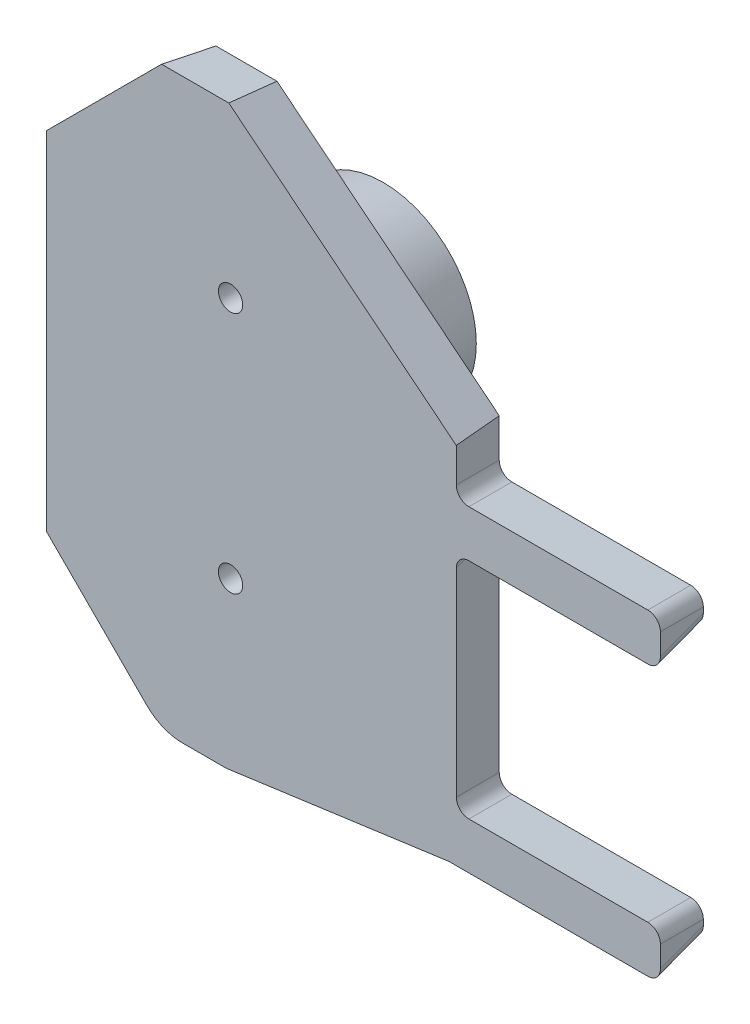
ISO-10303-21;
HEADER;
FILE_DESCRIPTION(('STEP AP214'),'2;1');
FILE_NAME('part.step','',(''),(''),'','','');
FILE_SCHEMA(('AUTOMOTIVE_DESIGN { 1 0 10303 214 1 1 1 1 }'));
ENDSEC;
DATA;
#1=APPLICATION_CONTEXT('core data for automotive mechanical design processes');
#2=APPLICATION_PROTOCOL_DEFINITION('international standard','automotive_design',2000,#1);
#3=PRODUCT_CONTEXT('',#1,'mechanical');
#4=PRODUCT('Part','Part','',(#3));
#5=PRODUCT_RELATED_PRODUCT_CATEGORY('part','',(#4));
#6=PRODUCT_DEFINITION_FORMATION('','',#4);
#7=PRODUCT_DEFINITION_CONTEXT('part definition',#1,'design');
#8=PRODUCT_DEFINITION('design','',#6,#7);
#9=PRODUCT_DEFINITION_SHAPE('','',#8);
#10=(LENGTH_UNIT() NAMED_UNIT(*) SI_UNIT(.MILLI.,.METRE.));
#11=(NAMED_UNIT(*) PLANE_ANGLE_UNIT() SI_UNIT($,.RADIAN.));
#12=(NAMED_UNIT(*) SI_UNIT($,.STERADIAN.) SOLID_ANGLE_UNIT());
#13=UNCERTAINTY_MEASURE_WITH_UNIT(LENGTH_MEASURE(1.E-05),#10,'distance_accuracy_value','');
#14=(GEOMETRIC_REPRESENTATION_CONTEXT(3) GLOBAL_UNCERTAINTY_ASSIGNED_CONTEXT((#13)) GLOBAL_UNIT_ASSIGNED_CONTEXT((#10,
#11,#12)) REPRESENTATION_CONTEXT('',''));
#15=CARTESIAN_POINT('',(0.,0.,0.));
#16=DIRECTION('',(0.,0.,1.));
#17=DIRECTION('',(1.,0.,0.));
#18=AXIS2_PLACEMENT_3D('',#15,#16,#17);
#19=CARTESIAN_POINT('',(-40.4268303628914,-40.6742120332045,0.0633692972967055));
#20=DIRECTION('',(-0.69840112333371,-0.69840112333371,-0.156434465040231));
#21=DIRECTION('',(0.707106781186547,-0.707106781186547,0.));
#22=AXIS2_PLACEMENT_3D('',#19,#20,#21);
#23=PLANE('',#22);
#24=DIRECTION('',(0.707106781186548,-0.707106781186548,0.));
#25=VECTOR('',#24,1.);
#26=CARTESIAN_POINT('',(-40.4268303628914,-40.6742120332045,0.0633692972967055));
#27=LINE('',#26,#25);
#28=CARTESIAN_POINT('',(-46.1856163813293,-34.9154260147665,0.0633692972967055));
#29=VERTEX_POINT('',#28);
#30=CARTESIAN_POINT('',(-26.5497627576595,-54.5512796384364,0.0633692972967055));
#31=VERTEX_POINT('',#30);
#32=EDGE_CURVE('E214',#29,#31,#27,.T.);
#33=ORIENTED_EDGE('',*,*,#32,.T.);
#34=DIRECTION('',(-0.0646616721689631,-0.156107085916033,0.98562135015386));
#35=VECTOR('',#34,1.);
#36=CARTESIAN_POINT('',(-26.4677074714418,-54.3531806535852,-1.18737846836287));
#37=LINE('',#36,#35);
#38=CARTESIAN_POINT('',(-27.2386150817981,-56.214316261844,10.5633692972967));
#39=VERTEX_POINT('',#38);
#40=EDGE_CURVE('E316',#31,#39,#37,.T.);
#41=ORIENTED_EDGE('',*,*,#40,.T.);
#42=DIRECTION('',(-0.707106781186547,0.707106781186547,0.));
#43=VECTOR('',#42,1.);
#44=CARTESIAN_POINT('',(-41.6027748366645,-41.8501565069776,10.5633692972967));
#45=LINE('',#44,#43);
#46=CARTESIAN_POINT('',(-47.848653004737,-35.6042783389051,10.5633692972967));
#47=VERTEX_POINT('',#46);
#48=EDGE_CURVE('E263',#47,#39,#45,.F.);
#49=ORIENTED_EDGE('',*,*,#48,.F.);
#50=DIRECTION('',(0.156107085916033,0.064661672168963,-0.98562135015386));
#51=VECTOR('',#50,1.);
#52=CARTESIAN_POINT('',(-46.1034081153843,-34.8813742360729,-0.455673266332319));
#53=LINE('',#52,#51);
#54=EDGE_CURVE('E264',#47,#29,#53,.T.);
#55=ORIENTED_EDGE('',*,*,#54,.T.);
#56=EDGE_LOOP('',(#33,#41,#49,#55));
#57=FACE_BOUND('',#56,.T.);
#58=ADVANCED_FACE('F46',(#57),#23,.T.);
#59=CARTESIAN_POINT('',(0.408586250631603,-57.5887954196814,0.0633692972967055));
#60=DIRECTION('',(0.,-0.987688340595138,-0.156434465040231));
#61=DIRECTION('',(0.,0.156434465040231,-0.987688340595138));
#62=AXIS2_PLACEMENT_3D('',#59,#60,#61);
#63=PLANE('',#62);
#64=DIRECTION('',(-1.,0.,0.));
#65=VECTOR('',#64,1.);
#66=CARTESIAN_POINT('',(0.4085862506316,-59.251832043089,10.5633692972967));
#67=LINE('',#66,#65);
#68=CARTESIAN_POINT('',(-19.9054032867942,-59.251832043089,10.5633692972967));
#69=VERTEX_POINT('',#68);
#70=CARTESIAN_POINT('',(-10.844543477793,-59.251832043089,10.5633692972967));
#71=VERTEX_POINT('',#70);
#72=EDGE_CURVE('E280',#69,#71,#67,.F.);
#73=ORIENTED_EDGE('',*,*,#72,.F.);
#74=DIRECTION('',(-0.0646616721689631,-0.156107085916033,0.98562135015386));
#75=VECTOR('',#74,1.);
#76=CARTESIAN_POINT('',(-19.1344956764379,-57.3906964348302,-1.18737846836287));
#77=LINE('',#76,#75);
#78=CARTESIAN_POINT('',(-19.2165509626556,-57.5887954196813,0.0633692972967055));
#79=VERTEX_POINT('',#78);
#80=EDGE_CURVE('E210',#69,#79,#77,.F.);
#81=ORIENTED_EDGE('',*,*,#80,.T.);
#82=DIRECTION('',(1.,0.,0.));
#83=VECTOR('',#82,1.);
#84=CARTESIAN_POINT('',(0.408586250631603,-57.5887954196814,0.0633692972967055));
#85=LINE('',#84,#83);
#86=CARTESIAN_POINT('',(-10.9585191605095,-57.5887954196814,0.0633692972967055));
#87=VERTEX_POINT('',#86);
#88=EDGE_CURVE('E203',#79,#87,#85,.T.);
#89=ORIENTED_EDGE('',*,*,#88,.T.);
#90=DIRECTION('',(-0.0107205698794064,0.156425475227009,-0.987631581148287));
#91=VECTOR('',#90,1.);
#92=CARTESIAN_POINT('',(-10.9607188832447,-57.5566989287221,-0.139279971113321));
#93=LINE('',#92,#91);
#94=EDGE_CURVE('E207',#71,#87,#93,.T.);
#95=ORIENTED_EDGE('',*,*,#94,.F.);
#96=EDGE_LOOP('',(#73,#81,#89,#95));
#97=FACE_BOUND('',#96,.T.);
#98=ADVANCED_FACE('F206',(#97),#63,.T.);
#99=CARTESIAN_POINT('',(8.0020951925133,-54.977611409875,0.0633692972967055));
#100=DIRECTION('',(0.134748892743105,-0.978453368358495,-0.156434465040231));
#101=DIRECTION('',(0.,0.157874313713471,-0.987459214889152));
#102=AXIS2_PLACEMENT_3D('',#99,#100,#101);
#103=PLANE('',#102);
#104=DIRECTION('',(0.990649912672778,0.136428554640942,0.));
#105=VECTOR('',#104,1.);
#106=CARTESIAN_POINT('',(8.0020951925133,-54.977611409875,0.0633692972967055));
#107=LINE('',#106,#105);
#108=CARTESIAN_POINT('',(34.787728509299,-51.2887954196813,0.0633692972967055));
#109=VERTEX_POINT('',#108);
#110=EDGE_CURVE('E213',#87,#109,#107,.T.);
#111=ORIENTED_EDGE('',*,*,#110,.T.);
#112=DIRECTION('',(-0.0107205698794066,0.156425475227009,-0.987631581148287));
#113=VECTOR('',#112,1.);
#114=CARTESIAN_POINT('',(34.7908360545234,-51.3341380874654,0.349651634697889));
#115=LINE('',#114,#113);
#116=CARTESIAN_POINT('',(34.9017041920156,-52.951832043089,10.5633692972967));
#117=VERTEX_POINT('',#116);
#118=EDGE_CURVE('E221',#117,#109,#115,.T.);
#119=ORIENTED_EDGE('',*,*,#118,.F.);
#120=DIRECTION('',(-0.990649912672779,-0.136428554640942,0.));
#121=VECTOR('',#120,1.);
#122=CARTESIAN_POINT('',(8.22898087535975,-56.6250984956254,10.5633692972967));
#123=LINE('',#122,#121);
#124=EDGE_CURVE('E220',#71,#117,#123,.F.);
#125=ORIENTED_EDGE('',*,*,#124,.F.);
#126=ORIENTED_EDGE('',*,*,#94,.T.);
#127=EDGE_LOOP('',(#111,#119,#125,#126));
#128=FACE_BOUND('',#127,.T.);
#129=ADVANCED_FACE('F217',(#128),#103,.T.);
#130=CARTESIAN_POINT('',(0.408586250631704,-51.2887954196813,0.0633692972967055));
#131=DIRECTION('',(0.,-0.987688340595138,-0.156434465040231));
#132=DIRECTION('',(0.,0.156434465040231,-0.987688340595138));
#133=AXIS2_PLACEMENT_3D('',#130,#131,#132);
#134=PLANE('',#133);
#135=DIRECTION('',(1.,0.,0.));
#136=VECTOR('',#135,1.);
#137=CARTESIAN_POINT('',(0.408586250631704,-51.2887954196813,0.0633692972967055));
#138=LINE('',#137,#136);
#139=CARTESIAN_POINT('',(74.1950466152367,-51.2887954196813,0.0633692972967055));
#140=VERTEX_POINT('',#139);
#141=EDGE_CURVE('E227',#109,#140,#138,.T.);
#142=ORIENTED_EDGE('',*,*,#141,.T.);
#143=DIRECTION('',(0.154554782932108,-0.154554782932108,0.975820494837866));
#144=VECTOR('',#143,1.);
#145=CARTESIAN_POINT('',(72.4324960865304,-49.526244890975,-11.0649367730141));
#146=LINE('',#145,#144);
#147=CARTESIAN_POINT('',(75.8580832386444,-52.951832043089,10.5633692972967));
#148=VERTEX_POINT('',#147);
#149=EDGE_CURVE('E355',#140,#148,#146,.T.);
#150=ORIENTED_EDGE('',*,*,#149,.T.);
#151=DIRECTION('',(-1.,0.,0.));
#152=VECTOR('',#151,1.);
#153=CARTESIAN_POINT('',(0.408586250631704,-52.951832043089,10.5633692972967));
#154=LINE('',#153,#152);
#155=EDGE_CURVE('E283',#117,#148,#154,.F.);
#156=ORIENTED_EDGE('',*,*,#155,.F.);
#157=ORIENTED_EDGE('',*,*,#118,.T.);
#158=EDGE_LOOP('',(#142,#150,#156,#157));
#159=FACE_BOUND('',#158,.T.);
#160=ADVANCED_FACE('F516',(#159),#134,.T.);
#161=CARTESIAN_POINT('',(76.787728509299,0.161204580318667,0.0633692972967055));
#162=DIRECTION('',(0.987688340595138,0.,-0.156434465040231));
#163=DIRECTION('',(-0.156434465040231,0.,-0.987688340595138));
#164=AXIS2_PLACEMENT_3D('',#161,#162,#163);
#165=PLANE('',#164);
#166=DIRECTION('',(0.,-1.,0.));
#167=VECTOR('',#166,1.);
#168=CARTESIAN_POINT('',(78.4507651327066,0.161204580318667,10.5633692972967));
#169=LINE('',#168,#167);
#170=CARTESIAN_POINT('',(78.4507651327066,-50.3591501490267,10.5633692972967));
#171=VERTEX_POINT('',#170);
#172=CARTESIAN_POINT('',(78.4507651327066,-45.9184406903359,10.5633692972967));
#173=VERTEX_POINT('',#172);
#174=EDGE_CURVE('E286',#171,#173,#169,.F.);
#175=ORIENTED_EDGE('',*,*,#174,.F.);
#176=DIRECTION('',(0.154554782932108,-0.154554782932108,0.975820494837866));
#177=VECTOR('',#176,1.);
#178=CARTESIAN_POINT('',(75.6206649120851,-47.5290499284052,-7.30518025733438));
#179=LINE('',#178,#177);
#180=CARTESIAN_POINT('',(76.787728509299,-48.6961135256191,0.0633692972967055));
#181=VERTEX_POINT('',#180);
#182=EDGE_CURVE('E352',#171,#181,#179,.F.);
#183=ORIENTED_EDGE('',*,*,#182,.T.);
#184=DIRECTION('',(0.,1.,0.));
#185=VECTOR('',#184,1.);
#186=CARTESIAN_POINT('',(76.787728509299,0.161204580318667,0.0633692972967055));
#187=LINE('',#186,#185);
#188=CARTESIAN_POINT('',(76.787728509299,-47.5814773137436,0.0633692972967055));
#189=VERTEX_POINT('',#188);
#190=EDGE_CURVE('E229',#181,#189,#187,.T.);
#191=ORIENTED_EDGE('',*,*,#190,.T.);
#192=DIRECTION('',(-0.154554782932108,-0.154554782932108,-0.975820494837866));
#193=VECTOR('',#192,1.);
#194=CARTESIAN_POINT('',(78.5126969941967,-45.8565088288458,10.9543916815866));
#195=LINE('',#194,#193);
#196=EDGE_CURVE('E350',#189,#173,#195,.F.);
#197=ORIENTED_EDGE('',*,*,#196,.T.);
#198=EDGE_LOOP('',(#175,#183,#191,#197));
#199=FACE_BOUND('',#198,.T.);
#200=ADVANCED_FACE('F512',(#199),#165,.T.);
#201=CARTESIAN_POINT('',(0.408586250631704,-44.9887954196813,0.0633692972967055));
#202=DIRECTION('',(0.,0.987688340595138,-0.156434465040231));
#203=DIRECTION('',(0.,0.156434465040231,0.987688340595138));
#204=AXIS2_PLACEMENT_3D('',#201,#202,#203);
#205=PLANE('',#204);
#206=DIRECTION('',(1.,0.,0.));
#207=VECTOR('',#206,1.);
#208=CARTESIAN_POINT('',(0.408586250631704,-43.3257587962737,10.5633692972967));
#209=LINE('',#208,#207);
#210=CARTESIAN_POINT('',(39.0434470267688,-43.3257587962737,10.5633692972967));
#211=VERTEX_POINT('',#210);
#212=CARTESIAN_POINT('',(75.8580832386444,-43.3257587962737,10.5633692972967));
#213=VERTEX_POINT('',#212);
#214=EDGE_CURVE('E289',#211,#213,#209,.T.);
#215=ORIENTED_EDGE('',*,*,#214,.T.);
#216=DIRECTION('',(0.154554782932108,0.154554782932108,0.975820494837866));
#217=VECTOR('',#216,1.);
#218=CARTESIAN_POINT('',(74.2569784767269,-44.9268635581912,0.454391681586574));
#219=LINE('',#218,#217);
#220=CARTESIAN_POINT('',(74.1950466152367,-44.9887954196813,0.0633692972967055));
#221=VERTEX_POINT('',#220);
#222=EDGE_CURVE('E359',#213,#221,#219,.F.);
#223=ORIENTED_EDGE('',*,*,#222,.T.);
#224=DIRECTION('',(1.,0.,0.));
#225=VECTOR('',#224,1.);
#226=CARTESIAN_POINT('',(0.408586250631704,-44.9887954196813,0.0633692972967055));
#227=LINE('',#226,#225);
#228=CARTESIAN_POINT('',(37.3804104033612,-44.9887954196813,0.0633692972967055));
#229=VERTEX_POINT('',#228);
#230=EDGE_CURVE('E235',#229,#221,#227,.T.);
#231=ORIENTED_EDGE('',*,*,#230,.F.);
#232=DIRECTION('',(-0.154554782932108,-0.154554782932108,-0.975820494837866));
#233=VECTOR('',#232,1.);
#234=CARTESIAN_POINT('',(38.9815151652787,-43.3876906577638,10.1723469130068));
#235=LINE('',#234,#233);
#236=EDGE_CURVE('E357',#229,#211,#235,.F.);
#237=ORIENTED_EDGE('',*,*,#236,.T.);
#238=EDGE_LOOP('',(#215,#223,#231,#237));
#239=FACE_BOUND('',#238,.T.);
#240=ADVANCED_FACE('F509',(#239),#205,.T.);
#241=CARTESIAN_POINT('',(34.787728509299,0.161204580318667,0.0633692972967055));
#242=DIRECTION('',(0.987688340595138,0.,-0.156434465040231));
#243=DIRECTION('',(-0.156434465040231,0.,-0.987688340595138));
#244=AXIS2_PLACEMENT_3D('',#241,#242,#243);
#245=PLANE('',#244);
#246=DIRECTION('',(0.,-1.,0.));
#247=VECTOR('',#246,1.);
#248=CARTESIAN_POINT('',(36.4507651327066,0.161204580318667,10.5633692972967));
#249=LINE('',#248,#247);
#250=CARTESIAN_POINT('',(36.4507651327066,0.105486062848807,10.5633692972967));
#251=VERTEX_POINT('',#250);
#252=CARTESIAN_POINT('',(36.4507651327066,-40.7330769022114,10.5633692972967));
#253=VERTEX_POINT('',#252);
#254=EDGE_CURVE('E292',#251,#253,#249,.T.);
#255=ORIENTED_EDGE('',*,*,#254,.T.);
#256=DIRECTION('',(-0.154554782932108,-0.154554782932108,-0.975820494837866));
#257=VECTOR('',#256,1.);
#258=CARTESIAN_POINT('',(34.7257966478088,-42.4580453871092,-0.327653086993164));
#259=LINE('',#258,#257);
#260=CARTESIAN_POINT('',(34.787728509299,-42.3961135256191,0.0633692972967055));
#261=VERTEX_POINT('',#260);
#262=EDGE_CURVE('E364',#253,#261,#259,.T.);
#263=ORIENTED_EDGE('',*,*,#262,.T.);
#264=DIRECTION('',(0.,-1.,0.));
#265=VECTOR('',#264,1.);
#266=CARTESIAN_POINT('',(34.787728509299,0.161204580318667,0.0633692972967055));
#267=LINE('',#266,#265);
#268=CARTESIAN_POINT('',(34.787728509299,1.76852268625644,0.0633692972967055));
#269=VERTEX_POINT('',#268);
#270=EDGE_CURVE('E238',#269,#261,#267,.T.);
#271=ORIENTED_EDGE('',*,*,#270,.F.);
#272=DIRECTION('',(0.154554782932108,-0.154554782932108,0.975820494837866));
#273=VECTOR('',#272,1.);
#274=CARTESIAN_POINT('',(34.8261228077031,1.73012838785236,0.305781357000386));
#275=LINE('',#274,#273);
#276=EDGE_CURVE('E362',#269,#251,#275,.T.);
#277=ORIENTED_EDGE('',*,*,#276,.T.);
#278=EDGE_LOOP('',(#255,#263,#271,#277));
#279=FACE_BOUND('',#278,.T.);
#280=ADVANCED_FACE('F382',(#279),#245,.T.);
#281=CARTESIAN_POINT('',(0.408586250631704,4.36120458031868,0.0633692972967055));
#282=DIRECTION('',(0.,-0.987688340595138,-0.156434465040231));
#283=DIRECTION('',(0.,0.156434465040231,-0.987688340595138));
#284=AXIS2_PLACEMENT_3D('',#281,#282,#283);
#285=PLANE('',#284);
#286=DIRECTION('',(1.,0.,0.));
#287=VECTOR('',#286,1.);
#288=CARTESIAN_POINT('',(0.408586250631704,4.36120458031868,0.0633692972967055));
#289=LINE('',#288,#287);
#290=CARTESIAN_POINT('',(37.3804104033612,4.36120458031868,0.0633692972967055));
#291=VERTEX_POINT('',#290);
#292=CARTESIAN_POINT('',(74.1950466152367,4.36120458031868,0.0633692972967055));
#293=VERTEX_POINT('',#292);
#294=EDGE_CURVE('E241',#291,#293,#289,.T.);
#295=ORIENTED_EDGE('',*,*,#294,.T.);
#296=DIRECTION('',(0.154554782932108,-0.154554782932108,0.975820494837866));
#297=VECTOR('',#296,1.);
#298=CARTESIAN_POINT('',(72.4324960865304,6.12375510902501,-11.0649367730141));
#299=LINE('',#298,#297);
#300=CARTESIAN_POINT('',(75.8580832386444,2.69816795691104,10.5633692972967));
#301=VERTEX_POINT('',#300);
#302=EDGE_CURVE('E336',#293,#301,#299,.T.);
#303=ORIENTED_EDGE('',*,*,#302,.T.);
#304=DIRECTION('',(-1.,0.,0.));
#305=VECTOR('',#304,1.);
#306=CARTESIAN_POINT('',(0.408586250631704,2.69816795691104,10.5633692972967));
#307=LINE('',#306,#305);
#308=CARTESIAN_POINT('',(39.0434470267688,2.69816795691104,10.5633692972967));
#309=VERTEX_POINT('',#308);
#310=EDGE_CURVE('E295',#309,#301,#307,.F.);
#311=ORIENTED_EDGE('',*,*,#310,.F.);
#312=DIRECTION('',(-0.154554782932108,0.154554782932108,-0.975820494837866));
#313=VECTOR('',#312,1.);
#314=CARTESIAN_POINT('',(36.4972577506167,5.24435723306322,-5.5126371016584));
#315=LINE('',#314,#313);
#316=EDGE_CURVE('E333',#309,#291,#315,.T.);
#317=ORIENTED_EDGE('',*,*,#316,.T.);
#318=EDGE_LOOP('',(#295,#303,#311,#317));
#319=FACE_BOUND('',#318,.T.);
#320=ADVANCED_FACE('F390',(#319),#285,.T.);
#321=CARTESIAN_POINT('',(76.787728509299,0.161204580318667,0.0633692972967055));
#322=DIRECTION('',(0.987688340595138,0.,-0.156434465040231));
#323=DIRECTION('',(-0.156434465040231,0.,-0.987688340595138));
#324=AXIS2_PLACEMENT_3D('',#321,#322,#323);
#325=PLANE('',#324);
#326=DIRECTION('',(0.,-1.,0.));
#327=VECTOR('',#326,1.);
#328=CARTESIAN_POINT('',(78.4507651327066,0.161204580318667,10.5633692972967));
#329=LINE('',#328,#327);
#330=CARTESIAN_POINT('',(78.4507651327066,5.29084985097328,10.5633692972967));
#331=VERTEX_POINT('',#330);
#332=CARTESIAN_POINT('',(78.4507651327066,9.73155930966407,10.5633692972967));
#333=VERTEX_POINT('',#332);
#334=EDGE_CURVE('E298',#331,#333,#329,.F.);
#335=ORIENTED_EDGE('',*,*,#334,.F.);
#336=DIRECTION('',(0.154554782932108,-0.154554782932108,0.975820494837866));
#337=VECTOR('',#336,1.);
#338=CARTESIAN_POINT('',(76.9499865306833,6.7916284529966,1.08782612558012));
#339=LINE('',#338,#337);
#340=CARTESIAN_POINT('',(76.787728509299,6.95388647438091,0.0633692972967055));
#341=VERTEX_POINT('',#340);
#342=EDGE_CURVE('E322',#331,#341,#339,.F.);
#343=ORIENTED_EDGE('',*,*,#342,.T.);
#344=DIRECTION('',(0.,1.,0.));
#345=VECTOR('',#344,1.);
#346=CARTESIAN_POINT('',(76.787728509299,0.161204580318667,0.0633692972967055));
#347=LINE('',#346,#345);
#348=CARTESIAN_POINT('',(76.787728509299,8.06852268625644,0.0633692972967055));
#349=VERTEX_POINT('',#348);
#350=EDGE_CURVE('E244',#341,#349,#347,.T.);
#351=ORIENTED_EDGE('',*,*,#350,.T.);
#352=DIRECTION('',(-0.154554782932108,-0.154554782932108,-0.975820494837866));
#353=VECTOR('',#352,1.);
#354=CARTESIAN_POINT('',(78.5126969941967,9.79349117115419,10.9543916815866));
#355=LINE('',#354,#353);
#356=EDGE_CURVE('E320',#349,#333,#355,.F.);
#357=ORIENTED_EDGE('',*,*,#356,.T.);
#358=EDGE_LOOP('',(#335,#343,#351,#357));
#359=FACE_BOUND('',#358,.T.);
#360=ADVANCED_FACE('F397',(#359),#325,.T.);
#361=CARTESIAN_POINT('',(0.408586250631704,10.6612045803187,0.0633692972967055));
#362=DIRECTION('',(0.,0.987688340595138,-0.156434465040231));
#363=DIRECTION('',(0.,0.156434465040231,0.987688340595138));
#364=AXIS2_PLACEMENT_3D('',#361,#362,#363);
#365=PLANE('',#364);
#366=DIRECTION('',(1.,0.,0.));
#367=VECTOR('',#366,1.);
#368=CARTESIAN_POINT('',(0.408586250631704,12.3242412037263,10.5633692972967));
#369=LINE('',#368,#367);
#370=CARTESIAN_POINT('',(39.0434470267688,12.3242412037263,10.5633692972967));
#371=VERTEX_POINT('',#370);
#372=CARTESIAN_POINT('',(75.8580832386444,12.3242412037263,10.5633692972967));
#373=VERTEX_POINT('',#372);
#374=EDGE_CURVE('E300',#371,#373,#369,.T.);
#375=ORIENTED_EDGE('',*,*,#374,.T.);
#376=DIRECTION('',(0.154554782932108,0.154554782932108,0.975820494837866));
#377=VECTOR('',#376,1.);
#378=CARTESIAN_POINT('',(74.2569784767269,10.7231364418088,0.454391681586574));
#379=LINE('',#378,#377);
#380=CARTESIAN_POINT('',(74.1950466152367,10.6612045803187,0.0633692972967055));
#381=VERTEX_POINT('',#380);
#382=EDGE_CURVE('E347',#373,#381,#379,.F.);
#383=ORIENTED_EDGE('',*,*,#382,.T.);
#384=DIRECTION('',(1.,0.,0.));
#385=VECTOR('',#384,1.);
#386=CARTESIAN_POINT('',(0.408586250631704,10.6612045803187,0.0633692972967055));
#387=LINE('',#386,#385);
#388=CARTESIAN_POINT('',(37.3804104033612,10.6612045803187,0.0633692972967055));
#389=VERTEX_POINT('',#388);
#390=EDGE_CURVE('E247',#389,#381,#387,.T.);
#391=ORIENTED_EDGE('',*,*,#390,.F.);
#392=DIRECTION('',(-0.154554782932108,-0.154554782932108,-0.975820494837866));
#393=VECTOR('',#392,1.);
#394=CARTESIAN_POINT('',(38.9815151652787,12.2623093422362,10.1723469130068));
#395=LINE('',#394,#393);
#396=EDGE_CURVE('E345',#389,#371,#395,.F.);
#397=ORIENTED_EDGE('',*,*,#396,.T.);
#398=EDGE_LOOP('',(#375,#383,#391,#397));
#399=FACE_BOUND('',#398,.T.);
#400=ADVANCED_FACE('F404',(#399),#365,.T.);
#401=CARTESIAN_POINT('',(34.787728509299,0.161204580318667,0.0633692972967055));
#402=DIRECTION('',(0.987688340595138,0.,-0.156434465040231));
#403=DIRECTION('',(-0.156434465040231,0.,-0.987688340595138));
#404=AXIS2_PLACEMENT_3D('',#401,#402,#403);
#405=PLANE('',#404);
#406=DIRECTION('',(0.,-1.,0.));
#407=VECTOR('',#406,1.);
#408=CARTESIAN_POINT('',(36.4507651327066,0.161204580318667,10.5633692972967));
#409=LINE('',#408,#407);
#410=CARTESIAN_POINT('',(36.4507651327066,21.9584182212343,10.5633692972967));
#411=VERTEX_POINT('',#410);
#412=CARTESIAN_POINT('',(36.4507651327066,14.9169230977885,10.5633692972967));
#413=VERTEX_POINT('',#412);
#414=EDGE_CURVE('E302',#411,#413,#409,.T.);
#415=ORIENTED_EDGE('',*,*,#414,.T.);
#416=DIRECTION('',(-0.154554782932108,-0.154554782932108,-0.975820494837866));
#417=VECTOR('',#416,1.);
#418=CARTESIAN_POINT('',(34.7257966478088,13.1919546128908,-0.327653086993164));
#419=LINE('',#418,#417);
#420=CARTESIAN_POINT('',(34.787728509299,13.2538864743809,0.0633692972967055));
#421=VERTEX_POINT('',#420);
#422=EDGE_CURVE('E367',#413,#421,#419,.T.);
#423=ORIENTED_EDGE('',*,*,#422,.T.);
#424=DIRECTION('',(0.,-1.,0.));
#425=VECTOR('',#424,1.);
#426=CARTESIAN_POINT('',(34.787728509299,0.161204580318667,0.0633692972967055));
#427=LINE('',#426,#425);
#428=CARTESIAN_POINT('',(34.787728509299,21.1612045803187,0.0633692972967055));
#429=VERTEX_POINT('',#428);
#430=EDGE_CURVE('E250',#429,#421,#427,.T.);
#431=ORIENTED_EDGE('',*,*,#430,.F.);
#432=DIRECTION('',(-0.155996452907658,-0.0747803737103569,-0.98492284082966));
#433=VECTOR('',#432,1.);
#434=CARTESIAN_POINT('',(34.6284964285596,21.0848731363504,-0.941982493656503));
#435=LINE('',#434,#433);
#436=EDGE_CURVE('E275',#411,#429,#435,.T.);
#437=ORIENTED_EDGE('',*,*,#436,.F.);
#438=EDGE_LOOP('',(#415,#423,#431,#437));
#439=FACE_BOUND('',#438,.T.);
#440=ADVANCED_FACE('F411',(#439),#405,.T.);
#441=CARTESIAN_POINT('',(24.1463616202011,29.7098889663486,0.0633692972967055));
#442=DIRECTION('',(0.618573050083184,0.769997168733992,-0.156434465040231));
#443=DIRECTION('',(-0.779595280298667,0.62628364096154,0.));
#444=AXIS2_PLACEMENT_3D('',#441,#442,#443);
#445=PLANE('',#444);
#446=DIRECTION('',(0.779595280298667,-0.62628364096154,0.));
#447=VECTOR('',#446,1.);
#448=CARTESIAN_POINT('',(24.1463616202011,29.7098889663486,0.0633692972967055));
#449=LINE('',#448,#447);
#450=CARTESIAN_POINT('',(-10.9585191605095,57.9112045803187,0.0633692972967055));
#451=VERTEX_POINT('',#450);
#452=EDGE_CURVE('E253',#451,#429,#449,.T.);
#453=ORIENTED_EDGE('',*,*,#452,.F.);
#454=DIRECTION('',(-0.0549699216954338,-0.156197937818383,-0.986194966489934));
#455=VECTOR('',#454,1.);
#456=CARTESIAN_POINT('',(-10.9241712657154,58.0088046890649,0.679592131725592));
#457=LINE('',#456,#455);
#458=CARTESIAN_POINT('',(-10.3732553968377,59.5742412037263,10.5633692972967));
#459=VERTEX_POINT('',#458);
#460=EDGE_CURVE('E273',#459,#451,#457,.T.);
#461=ORIENTED_EDGE('',*,*,#460,.F.);
#462=DIRECTION('',(0.779595280298667,-0.62628364096154,0.));
#463=VECTOR('',#462,1.);
#464=CARTESIAN_POINT('',(25.1878942517612,31.006384468921,10.5633692972967));
#465=LINE('',#464,#463);
#466=EDGE_CURVE('E304',#459,#411,#465,.T.);
#467=ORIENTED_EDGE('',*,*,#466,.T.);
#468=ORIENTED_EDGE('',*,*,#436,.T.);
#469=EDGE_LOOP('',(#453,#461,#467,#468));
#470=FACE_BOUND('',#469,.T.);
#471=ADVANCED_FACE('F416',(#470),#445,.T.);
#472=CARTESIAN_POINT('',(0.408586250631704,57.9112045803187,0.0633692972967055));
#473=DIRECTION('',(0.,0.987688340595138,-0.156434465040231));
#474=DIRECTION('',(0.,0.156434465040231,0.987688340595138));
#475=AXIS2_PLACEMENT_3D('',#472,#473,#474);
#476=PLANE('',#475);
#477=DIRECTION('',(1.,0.,0.));
#478=VECTOR('',#477,1.);
#479=CARTESIAN_POINT('',(0.408586250631704,57.9112045803187,0.0633692972967055));
#480=LINE('',#479,#478);
#481=CARTESIAN_POINT('',(-23.5122469764147,57.9112045803187,0.0633692972967055));
#482=VERTEX_POINT('',#481);
#483=EDGE_CURVE('E256',#482,#451,#480,.T.);
#484=ORIENTED_EDGE('',*,*,#483,.F.);
#485=DIRECTION('',(-0.0646616721689629,0.156107085916033,0.98562135015386));
#486=VECTOR('',#485,1.);
#487=CARTESIAN_POINT('',(-23.4122308187859,57.6697442161148,-1.46115144292961));
#488=LINE('',#487,#486);
#489=CARTESIAN_POINT('',(-24.2010993005533,59.5742412037263,10.5633692972967));
#490=VERTEX_POINT('',#489);
#491=EDGE_CURVE('E271',#490,#482,#488,.F.);
#492=ORIENTED_EDGE('',*,*,#491,.F.);
#493=DIRECTION('',(1.,0.,0.));
#494=VECTOR('',#493,1.);
#495=CARTESIAN_POINT('',(0.408586250631704,59.5742412037263,10.5633692972967));
#496=LINE('',#495,#494);
#497=EDGE_CURVE('E307',#490,#459,#496,.T.);
#498=ORIENTED_EDGE('',*,*,#497,.T.);
#499=ORIENTED_EDGE('',*,*,#460,.T.);
#500=EDGE_LOOP('',(#484,#492,#498,#499));
#501=FACE_BOUND('',#500,.T.);
#502=ADVANCED_FACE('F419',(#501),#476,.T.);
#503=CARTESIAN_POINT('',(-40.4268303628915,40.9966211938418,0.0633692972967055));
#504=DIRECTION('',(-0.69840112333371,0.69840112333371,-0.156434465040231));
#505=DIRECTION('',(-0.707106781186547,-0.707106781186547,0.));
#506=AXIS2_PLACEMENT_3D('',#503,#504,#505);
#507=PLANE('',#506);
#508=DIRECTION('',(-0.707106781186548,-0.707106781186548,0.));
#509=VECTOR('',#508,1.);
#510=CARTESIAN_POINT('',(-40.4268303628915,40.9966211938418,0.0633692972967055));
#511=LINE('',#510,#509);
#512=CARTESIAN_POINT('',(-46.1856163813294,35.2378351754039,0.0633692972967055));
#513=VERTEX_POINT('',#512);
#514=EDGE_CURVE('E259',#482,#513,#511,.T.);
#515=ORIENTED_EDGE('',*,*,#514,.T.);
#516=DIRECTION('',(0.156107085916033,-0.0646616721689629,-0.98562135015386));
#517=VECTOR('',#516,1.);
#518=CARTESIAN_POINT('',(-45.8315477785285,35.0911751581133,-2.17213187993663));
#519=LINE('',#518,#517);
#520=CARTESIAN_POINT('',(-47.848653004737,35.9266874995425,10.5633692972967));
#521=VERTEX_POINT('',#520);
#522=EDGE_CURVE('E267',#521,#513,#519,.T.);
#523=ORIENTED_EDGE('',*,*,#522,.F.);
#524=DIRECTION('',(0.707106781186547,0.707106781186547,0.));
#525=VECTOR('',#524,1.);
#526=CARTESIAN_POINT('',(-41.6027748366646,42.172565667615,10.5633692972967));
#527=LINE('',#526,#525);
#528=EDGE_CURVE('E310',#490,#521,#527,.F.);
#529=ORIENTED_EDGE('',*,*,#528,.F.);
#530=ORIENTED_EDGE('',*,*,#491,.T.);
#531=EDGE_LOOP('',(#515,#523,#529,#530));
#532=FACE_BOUND('',#531,.T.);
#533=ADVANCED_FACE('F425',(#532),#507,.T.);
#534=CARTESIAN_POINT('',(-46.1856163813294,0.161204580318628,0.0633692972967055));
#535=DIRECTION('',(-0.987688340595138,0.,-0.156434465040231));
#536=DIRECTION('',(-0.156434465040231,0.,0.987688340595138));
#537=AXIS2_PLACEMENT_3D('',#534,#535,#536);
#538=PLANE('',#537);
#539=DIRECTION('',(0.,-1.,0.));
#540=VECTOR('',#539,1.);
#541=CARTESIAN_POINT('',(-46.1856163813294,0.161204580318628,0.0633692972967055));
#542=LINE('',#541,#540);
#543=EDGE_CURVE('E261',#513,#29,#542,.T.);
#544=ORIENTED_EDGE('',*,*,#543,.T.);
#545=ORIENTED_EDGE('',*,*,#54,.F.);
#546=DIRECTION('',(0.,1.,0.));
#547=VECTOR('',#546,1.);
#548=CARTESIAN_POINT('',(-47.848653004737,0.161204580318627,10.5633692972967));
#549=LINE('',#548,#547);
#550=EDGE_CURVE('E268',#521,#47,#549,.F.);
#551=ORIENTED_EDGE('',*,*,#550,.F.);
#552=ORIENTED_EDGE('',*,*,#522,.T.);
#553=EDGE_LOOP('',(#544,#545,#551,#552));
#554=FACE_BOUND('',#553,.T.);
#555=ADVANCED_FACE('F429',(#554),#538,.T.);
#556=CARTESIAN_POINT('',(0.408586250631704,0.161204580318667,10.5633692972967));
#557=DIRECTION('',(0.,0.,1.));
#558=DIRECTION('',(1.,0.,0.));
#559=AXIS2_PLACEMENT_3D('',#556,#557,#558);
#560=PLANE('',#559);
#561=CARTESIAN_POINT('',(-9.99999999999999,25.,10.5633692972967));
#562=DIRECTION('',(0.,0.,1.));
#563=DIRECTION('',(1.,0.,0.));
#564=AXIS2_PLACEMENT_3D('',#561,#562,#563);
#565=CIRCLE('',#564,2.5);
#566=CARTESIAN_POINT('',(-7.49999999999999,25.,10.5633692972967));
#567=VERTEX_POINT('',#566);
#568=EDGE_CURVE('E452',#567,#567,#565,.T.);
#569=ORIENTED_EDGE('',*,*,#568,.F.);
#570=EDGE_LOOP('',(#569));
#571=FACE_BOUND('',#570,.T.);
#572=CARTESIAN_POINT('',(-9.99999999999999,-25.,10.5633692972967));
#573=DIRECTION('',(0.,0.,1.));
#574=DIRECTION('',(1.,0.,0.));
#575=AXIS2_PLACEMENT_3D('',#572,#573,#574);
#576=CIRCLE('',#575,2.5);
#577=CARTESIAN_POINT('',(-7.49999999999999,-25.,10.5633692972967));
#578=VERTEX_POINT('',#577);
#579=EDGE_CURVE('E449',#578,#578,#576,.T.);
#580=ORIENTED_EDGE('',*,*,#579,.F.);
#581=EDGE_LOOP('',(#580));
#582=FACE_BOUND('',#581,.T.);
#583=ORIENTED_EDGE('',*,*,#310,.T.);
#584=CARTESIAN_POINT('',(75.7930441775131,5.35588891210455,10.5633692972967));
#585=DIRECTION('',(0.,0.,1.));
#586=DIRECTION('',(-0.707106781186548,0.707106781186548,0.));
#587=AXIS2_PLACEMENT_3D('',#584,#585,#586);
#588=ELLIPSE('',#587,2.69004393111885,2.625);
#589=EDGE_CURVE('E343',#301,#331,#588,.T.);
#590=ORIENTED_EDGE('',*,*,#589,.T.);
#591=ORIENTED_EDGE('',*,*,#334,.T.);
#592=CARTESIAN_POINT('',(75.7930441775131,9.6665202485328,10.5633692972967));
#593=DIRECTION('',(0.,0.,1.));
#594=DIRECTION('',(-0.707106781186548,-0.707106781186548,0.));
#595=AXIS2_PLACEMENT_3D('',#592,#593,#594);
#596=ELLIPSE('',#595,2.69004393111885,2.625);
#597=EDGE_CURVE('E67',#333,#373,#596,.T.);
#598=ORIENTED_EDGE('',*,*,#597,.T.);
#599=ORIENTED_EDGE('',*,*,#374,.F.);
#600=CARTESIAN_POINT('',(39.1084860879001,14.9819621589198,10.5633692972967));
#601=DIRECTION('',(0.,0.,1.));
#602=DIRECTION('',(0.707106781186548,0.707106781186548,0.));
#603=AXIS2_PLACEMENT_3D('',#600,#601,#602);
#604=ELLIPSE('',#603,2.69004393111885,2.625);
#605=EDGE_CURVE('E61',#371,#413,#604,.F.);
#606=ORIENTED_EDGE('',*,*,#605,.T.);
#607=ORIENTED_EDGE('',*,*,#414,.F.);
#608=ORIENTED_EDGE('',*,*,#466,.F.);
#609=ORIENTED_EDGE('',*,*,#497,.F.);
#610=ORIENTED_EDGE('',*,*,#528,.T.);
#611=ORIENTED_EDGE('',*,*,#550,.T.);
#612=ORIENTED_EDGE('',*,*,#48,.T.);
#613=CARTESIAN_POINT('',(-19.7976430419758,-48.620948222315,10.5633692972967));
#614=DIRECTION('',(0.,0.,1.));
#615=DIRECTION('',(0.382683432365091,0.923879532511287,0.));
#616=AXIS2_PLACEMENT_3D('',#613,#614,#615);
#617=ELLIPSE('',#616,10.6531783208236,10.5);
#618=EDGE_CURVE('E318',#39,#69,#617,.T.);
#619=ORIENTED_EDGE('',*,*,#618,.T.);
#620=ORIENTED_EDGE('',*,*,#72,.T.);
#621=ORIENTED_EDGE('',*,*,#124,.T.);
#622=ORIENTED_EDGE('',*,*,#155,.T.);
#623=CARTESIAN_POINT('',(75.7930441775131,-50.2941110878954,10.5633692972967));
#624=DIRECTION('',(0.,0.,1.));
#625=DIRECTION('',(-0.707106781186548,0.707106781186548,0.));
#626=AXIS2_PLACEMENT_3D('',#623,#624,#625);
#627=ELLIPSE('',#626,2.69004393111885,2.625);
#628=EDGE_CURVE('E340',#148,#171,#627,.T.);
#629=ORIENTED_EDGE('',*,*,#628,.T.);
#630=ORIENTED_EDGE('',*,*,#174,.T.);
#631=CARTESIAN_POINT('',(75.7930441775131,-45.9834797514672,10.5633692972967));
#632=DIRECTION('',(0.,0.,1.));
#633=DIRECTION('',(-0.707106781186548,-0.707106781186548,0.));
#634=AXIS2_PLACEMENT_3D('',#631,#632,#633);
#635=ELLIPSE('',#634,2.69004393111885,2.625);
#636=EDGE_CURVE('E338',#173,#213,#635,.T.);
#637=ORIENTED_EDGE('',*,*,#636,.T.);
#638=ORIENTED_EDGE('',*,*,#214,.F.);
#639=CARTESIAN_POINT('',(39.1084860879001,-40.6680378410802,10.5633692972967));
#640=DIRECTION('',(0.,0.,1.));
#641=DIRECTION('',(0.707106781186548,0.707106781186548,0.));
#642=AXIS2_PLACEMENT_3D('',#639,#640,#641);
#643=ELLIPSE('',#642,2.69004393111885,2.625);
#644=EDGE_CURVE('E372',#211,#253,#643,.F.);
#645=ORIENTED_EDGE('',*,*,#644,.T.);
#646=ORIENTED_EDGE('',*,*,#254,.F.);
#647=CARTESIAN_POINT('',(39.1084860879001,0.0404470017175351,10.5633692972967));
#648=DIRECTION('',(0.,0.,1.));
#649=DIRECTION('',(0.707106781186548,-0.707106781186548,0.));
#650=AXIS2_PLACEMENT_3D('',#647,#648,#649);
#651=ELLIPSE('',#650,2.69004393111885,2.625);
#652=EDGE_CURVE('E11',#251,#309,#651,.F.);
#653=ORIENTED_EDGE('',*,*,#652,.T.);
#654=EDGE_LOOP('',(#583,#590,#591,#598,#599,#606,#607,#608,#609,#610,#611,#612,#619,#620,#621,
#622,#629,#630,#637,#638,#645,#646,#653));
#655=FACE_BOUND('',#654,.T.);
#656=ADVANCED_FACE('F387',(#571,#582,#655),#560,.T.);
#657=CARTESIAN_POINT('',(0.408586250631704,0.161204580318667,0.0633692972967055));
#658=DIRECTION('',(0.,0.,1.));
#659=DIRECTION('',(1.,0.,0.));
#660=AXIS2_PLACEMENT_3D('',#657,#658,#659);
#661=PLANE('',#660);
#662=CARTESIAN_POINT('',(-20.5914137493683,0.161204580318667,0.0633692972967055));
#663=DIRECTION('',(0.,0.,1.));
#664=DIRECTION('',(1.,0.,0.));
#665=AXIS2_PLACEMENT_3D('',#662,#663,#664);
#666=CIRCLE('',#665,24.15);
#667=CARTESIAN_POINT('',(3.5585862506317,0.161204580318667,0.0633692972967055));
#668=VERTEX_POINT('',#667);
#669=EDGE_CURVE('E440',#668,#668,#666,.T.);
#670=ORIENTED_EDGE('',*,*,#669,.T.);
#671=EDGE_LOOP('',(#670));
#672=FACE_BOUND('',#671,.T.);
#673=ORIENTED_EDGE('',*,*,#350,.F.);
#674=CARTESIAN_POINT('',(74.1300075541055,7.01892553551219,0.0633692972967055));
#675=DIRECTION('',(0.,0.,1.));
#676=DIRECTION('',(-0.707106781186548,0.707106781186548,0.));
#677=AXIS2_PLACEMENT_3D('',#674,#675,#676);
#678=ELLIPSE('',#677,2.69004393111885,2.625);
#679=EDGE_CURVE('E331',#341,#293,#678,.F.);
#680=ORIENTED_EDGE('',*,*,#679,.T.);
#681=ORIENTED_EDGE('',*,*,#294,.F.);
#682=CARTESIAN_POINT('',(37.4454494644925,1.70348362512517,0.0633692972967055));
#683=DIRECTION('',(0.,0.,1.));
#684=DIRECTION('',(0.707106781186548,-0.707106781186548,0.));
#685=AXIS2_PLACEMENT_3D('',#682,#683,#684);
#686=ELLIPSE('',#685,2.69004393111885,2.625);
#687=EDGE_CURVE('E54',#291,#269,#686,.T.);
#688=ORIENTED_EDGE('',*,*,#687,.T.);
#689=ORIENTED_EDGE('',*,*,#270,.T.);
#690=CARTESIAN_POINT('',(37.4454494644925,-42.3310744644878,0.0633692972967055));
#691=DIRECTION('',(0.,0.,1.));
#692=DIRECTION('',(0.707106781186548,0.707106781186548,0.));
#693=AXIS2_PLACEMENT_3D('',#690,#691,#692);
#694=ELLIPSE('',#693,2.69004393111885,2.625);
#695=EDGE_CURVE('E370',#261,#229,#694,.T.);
#696=ORIENTED_EDGE('',*,*,#695,.T.);
#697=ORIENTED_EDGE('',*,*,#230,.T.);
#698=CARTESIAN_POINT('',(74.1300075541055,-47.6465163748748,0.0633692972967055));
#699=DIRECTION('',(0.,0.,1.));
#700=DIRECTION('',(-0.707106781186548,-0.707106781186548,0.));
#701=AXIS2_PLACEMENT_3D('',#698,#699,#700);
#702=ELLIPSE('',#701,2.69004393111885,2.625);
#703=EDGE_CURVE('E325',#221,#189,#702,.F.);
#704=ORIENTED_EDGE('',*,*,#703,.T.);
#705=ORIENTED_EDGE('',*,*,#190,.F.);
#706=CARTESIAN_POINT('',(74.1300075541055,-48.6310744644878,0.0633692972967055));
#707=DIRECTION('',(0.,0.,1.));
#708=DIRECTION('',(-0.707106781186548,0.707106781186548,0.));
#709=AXIS2_PLACEMENT_3D('',#706,#707,#708);
#710=ELLIPSE('',#709,2.69004393111885,2.625);
#711=EDGE_CURVE('E327',#181,#140,#710,.F.);
#712=ORIENTED_EDGE('',*,*,#711,.T.);
#713=ORIENTED_EDGE('',*,*,#141,.F.);
#714=ORIENTED_EDGE('',*,*,#110,.F.);
#715=ORIENTED_EDGE('',*,*,#88,.F.);
#716=CARTESIAN_POINT('',(-19.1087907178372,-46.9579115989073,0.0633692972967055));
#717=DIRECTION('',(0.,0.,1.));
#718=DIRECTION('',(0.382683432365091,0.923879532511287,0.));
#719=AXIS2_PLACEMENT_3D('',#716,#717,#718);
#720=ELLIPSE('',#719,10.6531783208236,10.5);
#721=EDGE_CURVE('E314',#79,#31,#720,.F.);
#722=ORIENTED_EDGE('',*,*,#721,.T.);
#723=ORIENTED_EDGE('',*,*,#32,.F.);
#724=ORIENTED_EDGE('',*,*,#543,.F.);
#725=ORIENTED_EDGE('',*,*,#514,.F.);
#726=ORIENTED_EDGE('',*,*,#483,.T.);
#727=ORIENTED_EDGE('',*,*,#452,.T.);
#728=ORIENTED_EDGE('',*,*,#430,.T.);
#729=CARTESIAN_POINT('',(37.4454494644925,13.3189255355122,0.0633692972967055));
#730=DIRECTION('',(0.,0.,1.));
#731=DIRECTION('',(0.707106781186548,0.707106781186548,0.));
#732=AXIS2_PLACEMENT_3D('',#729,#730,#731);
#733=ELLIPSE('',#732,2.69004393111885,2.625);
#734=EDGE_CURVE('E374',#421,#389,#733,.T.);
#735=ORIENTED_EDGE('',*,*,#734,.T.);
#736=ORIENTED_EDGE('',*,*,#390,.T.);
#737=CARTESIAN_POINT('',(74.1300075541055,8.00348362512517,0.0633692972967055));
#738=DIRECTION('',(0.,0.,1.));
#739=DIRECTION('',(-0.707106781186548,-0.707106781186548,0.));
#740=AXIS2_PLACEMENT_3D('',#737,#738,#739);
#741=ELLIPSE('',#740,2.69004393111885,2.625);
#742=EDGE_CURVE('E329',#381,#349,#741,.F.);
#743=ORIENTED_EDGE('',*,*,#742,.T.);
#744=EDGE_LOOP('',(#673,#680,#681,#688,#689,#696,#697,#704,#705,#712,#713,#714,#715,#722,#723,
#724,#725,#726,#727,#728,#735,#736,#743));
#745=FACE_BOUND('',#744,.T.);
#746=ADVANCED_FACE('F225',(#672,#745),#661,.F.);
#747=CARTESIAN_POINT('',(-20.5914137493683,0.161204580318667,0.0633692972967055));
#748=DIRECTION('',(0.,0.,1.));
#749=DIRECTION('',(1.,0.,0.));
#750=AXIS2_PLACEMENT_3D('',#747,#748,#749);
#751=CONICAL_SURFACE('',#750,24.15,0.15707963267949);
#752=CARTESIAN_POINT('',(-20.5914137493683,0.161204580318667,-31.4366307027033));
#753=DIRECTION('',(0.,0.,1.));
#754=DIRECTION('',(1.,0.,0.));
#755=AXIS2_PLACEMENT_3D('',#752,#753,#754);
#756=CIRCLE('',#755,19.1608901297771);
#757=CARTESIAN_POINT('',(-1.43052361959121,0.161204580318667,-31.4366307027033));
#758=VERTEX_POINT('',#757);
#759=EDGE_CURVE('E438',#758,#758,#756,.T.);
#760=ORIENTED_EDGE('',*,*,#759,.T.);
#761=EDGE_LOOP('',(#760));
#762=FACE_BOUND('',#761,.T.);
#763=ORIENTED_EDGE('',*,*,#669,.F.);
#764=EDGE_LOOP('',(#763));
#765=FACE_BOUND('',#764,.T.);
#766=ADVANCED_FACE('F741',(#762,#765),#751,.T.);
#767=CARTESIAN_POINT('',(-20.5914137493683,0.161204580318667,-31.4366307027033));
#768=DIRECTION('',(0.,0.,1.));
#769=DIRECTION('',(1.,0.,0.));
#770=AXIS2_PLACEMENT_3D('',#767,#768,#769);
#771=PLANE('',#770);
#772=ORIENTED_EDGE('',*,*,#759,.F.);
#773=EDGE_LOOP('',(#772));
#774=FACE_BOUND('',#773,.T.);
#775=ADVANCED_FACE('F525',(#774),#771,.F.);
#776=CARTESIAN_POINT('',(-19.1344956764379,-47.0199688585812,0.455183414559563));
#777=DIRECTION('',(0.064661672168963,0.156107085916033,-0.98562135015386));
#778=DIRECTION('',(0.,0.987688340595138,0.156434465040231));
#779=AXIS2_PLACEMENT_3D('',#776,#777,#778);
#780=CYLINDRICAL_SURFACE('',#779,10.5);
#781=ORIENTED_EDGE('',*,*,#618,.F.);
#782=ORIENTED_EDGE('',*,*,#40,.F.);
#783=ORIENTED_EDGE('',*,*,#721,.F.);
#784=ORIENTED_EDGE('',*,*,#80,.F.);
#785=EDGE_LOOP('',(#781,#782,#783,#784));
#786=FACE_BOUND('',#785,.T.);
#787=ADVANCED_FACE('F437',(#786),#780,.T.);
#788=CARTESIAN_POINT('',(74.3573046366211,6.7916284529966,1.49846659631073));
#789=DIRECTION('',(-0.154554782932108,0.154554782932108,-0.975820494837866));
#790=DIRECTION('',(-0.987688340595138,0.,0.156434465040231));
#791=AXIS2_PLACEMENT_3D('',#788,#789,#790);
#792=CYLINDRICAL_SURFACE('',#791,2.625);
#793=ORIENTED_EDGE('',*,*,#589,.F.);
#794=ORIENTED_EDGE('',*,*,#302,.F.);
#795=ORIENTED_EDGE('',*,*,#679,.F.);
#796=ORIENTED_EDGE('',*,*,#342,.F.);
#797=EDGE_LOOP('',(#793,#794,#795,#796));
#798=FACE_BOUND('',#797,.T.);
#799=ADVANCED_FACE('F393',(#798),#792,.T.);
#800=CARTESIAN_POINT('',(72.4324960865304,6.30597215755011,-10.6542963022835));
#801=DIRECTION('',(-0.154554782932108,-0.154554782932108,-0.975820494837866));
#802=DIRECTION('',(-0.987688340595138,0.,0.156434465040231));
#803=AXIS2_PLACEMENT_3D('',#800,#801,#802);
#804=CYLINDRICAL_SURFACE('',#803,2.625);
#805=ORIENTED_EDGE('',*,*,#597,.F.);
#806=ORIENTED_EDGE('',*,*,#356,.F.);
#807=ORIENTED_EDGE('',*,*,#742,.F.);
#808=ORIENTED_EDGE('',*,*,#382,.F.);
#809=EDGE_LOOP('',(#805,#806,#807,#808));
#810=FACE_BOUND('',#809,.T.);
#811=ADVANCED_FACE('F400',(#810),#804,.T.);
#812=CARTESIAN_POINT('',(73.0279830180229,-47.5290499284052,-6.89453978660377));
#813=DIRECTION('',(-0.154554782932108,0.154554782932108,-0.975820494837866));
#814=DIRECTION('',(-0.987688340595138,0.,0.156434465040231));
#815=AXIS2_PLACEMENT_3D('',#812,#813,#814);
#816=CYLINDRICAL_SURFACE('',#815,2.625);
#817=ORIENTED_EDGE('',*,*,#628,.F.);
#818=ORIENTED_EDGE('',*,*,#149,.F.);
#819=ORIENTED_EDGE('',*,*,#711,.F.);
#820=ORIENTED_EDGE('',*,*,#182,.F.);
#821=EDGE_LOOP('',(#817,#818,#819,#820));
#822=FACE_BOUND('',#821,.T.);
#823=ADVANCED_FACE('F530',(#822),#816,.T.);
#824=CARTESIAN_POINT('',(72.4324960865304,-49.3440278424499,-10.6542963022835));
#825=DIRECTION('',(-0.154554782932108,-0.154554782932108,-0.975820494837866));
#826=DIRECTION('',(-0.987688340595138,0.,0.156434465040231));
#827=AXIS2_PLACEMENT_3D('',#824,#825,#826);
#828=CYLINDRICAL_SURFACE('',#827,2.625);
#829=ORIENTED_EDGE('',*,*,#636,.F.);
#830=ORIENTED_EDGE('',*,*,#196,.F.);
#831=ORIENTED_EDGE('',*,*,#703,.F.);
#832=ORIENTED_EDGE('',*,*,#222,.F.);
#833=EDGE_LOOP('',(#829,#830,#831,#832));
#834=FACE_BOUND('',#833,.T.);
#835=ADVANCED_FACE('F533',(#834),#828,.T.);
#836=CARTESIAN_POINT('',(38.3969847607338,-41.3795391682465,6.07112671520686));
#837=DIRECTION('',(0.154554782932108,0.154554782932108,0.975820494837866));
#838=DIRECTION('',(0.987688340595138,0.,-0.156434465040231));
#839=AXIS2_PLACEMENT_3D('',#836,#837,#838);
#840=CYLINDRICAL_SURFACE('',#839,2.625);
#841=ORIENTED_EDGE('',*,*,#644,.F.);
#842=ORIENTED_EDGE('',*,*,#236,.F.);
#843=ORIENTED_EDGE('',*,*,#695,.F.);
#844=ORIENTED_EDGE('',*,*,#262,.F.);
#845=EDGE_LOOP('',(#841,#842,#843,#844));
#846=FACE_BOUND('',#845,.T.);
#847=ADVANCED_FACE('F537',(#846),#840,.F.);
#848=CARTESIAN_POINT('',(37.0676631421356,12.9411392131553,-2.32187966770764));
#849=DIRECTION('',(0.154554782932108,0.154554782932108,0.975820494837866));
#850=DIRECTION('',(0.987688340595138,0.,-0.156434465040231));
#851=AXIS2_PLACEMENT_3D('',#848,#849,#850);
#852=CYLINDRICAL_SURFACE('',#851,2.625);
#853=ORIENTED_EDGE('',*,*,#605,.F.);
#854=ORIENTED_EDGE('',*,*,#396,.F.);
#855=ORIENTED_EDGE('',*,*,#734,.F.);
#856=ORIENTED_EDGE('',*,*,#422,.F.);
#857=EDGE_LOOP('',(#853,#854,#855,#856));
#858=FACE_BOUND('',#857,.T.);
#859=ADVANCED_FACE('F409',(#858),#852,.F.);
#860=CARTESIAN_POINT('',(36.4972577506167,2.65167533900098,-5.923277572389));
#861=DIRECTION('',(0.154554782932108,-0.154554782932108,0.975820494837866));
#862=DIRECTION('',(0.987688340595138,0.,-0.156434465040231));
#863=AXIS2_PLACEMENT_3D('',#860,#861,#862);
#864=CYLINDRICAL_SURFACE('',#863,2.625);
#865=ORIENTED_EDGE('',*,*,#652,.F.);
#866=ORIENTED_EDGE('',*,*,#276,.F.);
#867=ORIENTED_EDGE('',*,*,#687,.F.);
#868=ORIENTED_EDGE('',*,*,#316,.F.);
#869=EDGE_LOOP('',(#865,#866,#867,#868));
#870=FACE_BOUND('',#869,.T.);
#871=ADVANCED_FACE('F48',(#870),#864,.F.);
#872=CARTESIAN_POINT('',(-9.99999999999999,-25.,5.56336929729671));
#873=DIRECTION('',(0.,0.,1.));
#874=DIRECTION('',(1.,0.,0.));
#875=AXIS2_PLACEMENT_3D('',#872,#873,#874);
#876=CYLINDRICAL_SURFACE('',#875,2.5);
#877=CARTESIAN_POINT('',(-9.99999999999999,-25.,5.56336929729671));
#878=DIRECTION('',(0.,0.,1.));
#879=DIRECTION('',(1.,0.,0.));
#880=AXIS2_PLACEMENT_3D('',#877,#878,#879);
#881=CIRCLE('',#880,2.5);
#882=CARTESIAN_POINT('',(-7.49999999999999,-25.,5.56336929729671));
#883=VERTEX_POINT('',#882);
#884=EDGE_CURVE('E446',#883,#883,#881,.T.);
#885=ORIENTED_EDGE('',*,*,#884,.F.);
#886=EDGE_LOOP('',(#885));
#887=FACE_BOUND('',#886,.T.);
#888=ORIENTED_EDGE('',*,*,#579,.T.);
#889=EDGE_LOOP('',(#888));
#890=FACE_BOUND('',#889,.T.);
#891=ADVANCED_FACE('F472',(#887,#890),#876,.F.);
#892=CARTESIAN_POINT('',(-9.99999999999999,-25.,5.56336929729671));
#893=DIRECTION('',(0.,0.,1.));
#894=DIRECTION('',(1.,0.,0.));
#895=AXIS2_PLACEMENT_3D('',#892,#893,#894);
#896=PLANE('',#895);
#897=ORIENTED_EDGE('',*,*,#884,.T.);
#898=EDGE_LOOP('',(#897));
#899=FACE_BOUND('',#898,.T.);
#900=ADVANCED_FACE('F463',(#899),#896,.T.);
#901=CARTESIAN_POINT('',(-9.99999999999999,25.,5.56336929729671));
#902=DIRECTION('',(0.,0.,1.));
#903=DIRECTION('',(1.,0.,0.));
#904=AXIS2_PLACEMENT_3D('',#901,#902,#903);
#905=CYLINDRICAL_SURFACE('',#904,2.5);
#906=CARTESIAN_POINT('',(-9.99999999999999,25.,5.56336929729671));
#907=DIRECTION('',(0.,0.,1.));
#908=DIRECTION('',(1.,0.,0.));
#909=AXIS2_PLACEMENT_3D('',#906,#907,#908);
#910=CIRCLE('',#909,2.5);
#911=CARTESIAN_POINT('',(-7.49999999999999,25.,5.56336929729671));
#912=VERTEX_POINT('',#911);
#913=EDGE_CURVE('E445',#912,#912,#910,.T.);
#914=ORIENTED_EDGE('',*,*,#913,.F.);
#915=EDGE_LOOP('',(#914));
#916=FACE_BOUND('',#915,.T.);
#917=ORIENTED_EDGE('',*,*,#568,.T.);
#918=EDGE_LOOP('',(#917));
#919=FACE_BOUND('',#918,.T.);
#920=ADVANCED_FACE('F460',(#916,#919),#905,.F.);
#921=CARTESIAN_POINT('',(-9.99999999999999,25.,5.56336929729671));
#922=DIRECTION('',(0.,0.,1.));
#923=DIRECTION('',(1.,0.,0.));
#924=AXIS2_PLACEMENT_3D('',#921,#922,#923);
#925=PLANE('',#924);
#926=ORIENTED_EDGE('',*,*,#913,.T.);
#927=EDGE_LOOP('',(#926));
#928=FACE_BOUND('',#927,.T.);
#929=ADVANCED_FACE('F458',(#928),#925,.T.);
#930=CLOSED_SHELL('',(#58,#98,#129,#160,#200,#240,#280,#320,#360,#400,#440,#471,#502,#533,#555,
#656,#746,#766,#775,#787,#799,#811,#823,#835,#847,#859,#871,#891,#900,#920,#929));
#931=MANIFOLD_SOLID_BREP('B2',#930);
#932=ADVANCED_BREP_SHAPE_REPRESENTATION('',(#18,#931),#14);
#933=SHAPE_DEFINITION_REPRESENTATION(#9,#932);
ENDSEC;
END-ISO-10303-21;
